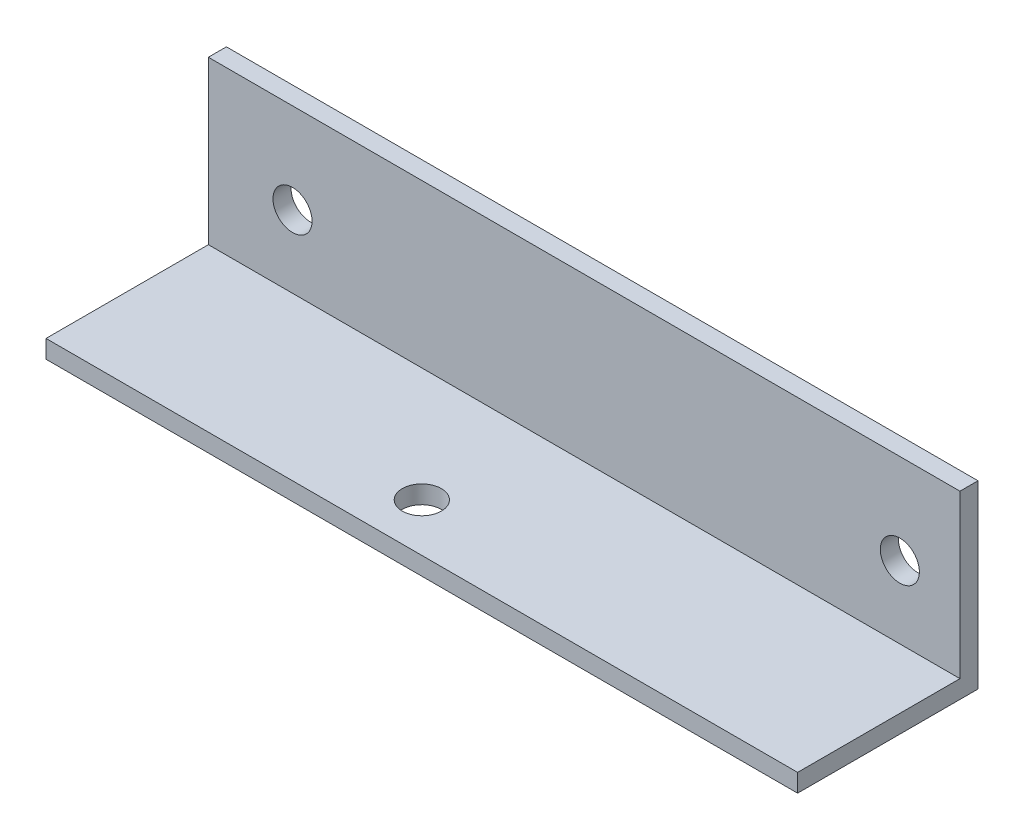
ISO-10303-21;
HEADER;
FILE_DESCRIPTION(('STEP AP214'),'2;1');
FILE_NAME('part.step','',(''),(''),'','','');
FILE_SCHEMA(('AUTOMOTIVE_DESIGN { 1 0 10303 214 1 1 1 1 }'));
ENDSEC;
DATA;
#1=APPLICATION_CONTEXT('core data for automotive mechanical design processes');
#2=APPLICATION_PROTOCOL_DEFINITION('international standard','automotive_design',2000,#1);
#3=PRODUCT_CONTEXT('',#1,'mechanical');
#4=PRODUCT('Part','Part','',(#3));
#5=PRODUCT_RELATED_PRODUCT_CATEGORY('part','',(#4));
#6=PRODUCT_DEFINITION_FORMATION('','',#4);
#7=PRODUCT_DEFINITION_CONTEXT('part definition',#1,'design');
#8=PRODUCT_DEFINITION('design','',#6,#7);
#9=PRODUCT_DEFINITION_SHAPE('','',#8);
#10=(LENGTH_UNIT() NAMED_UNIT(*) SI_UNIT(.MILLI.,.METRE.));
#11=(NAMED_UNIT(*) PLANE_ANGLE_UNIT() SI_UNIT($,.RADIAN.));
#12=(NAMED_UNIT(*) SI_UNIT($,.STERADIAN.) SOLID_ANGLE_UNIT());
#13=UNCERTAINTY_MEASURE_WITH_UNIT(LENGTH_MEASURE(1.E-05),#10,'distance_accuracy_value','');
#14=(GEOMETRIC_REPRESENTATION_CONTEXT(3) GLOBAL_UNCERTAINTY_ASSIGNED_CONTEXT((#13)) GLOBAL_UNIT_ASSIGNED_CONTEXT((#10,
#11,#12)) REPRESENTATION_CONTEXT('',''));
#15=CARTESIAN_POINT('',(0.,0.,0.));
#16=DIRECTION('',(0.,0.,1.));
#17=DIRECTION('',(1.,0.,0.));
#18=AXIS2_PLACEMENT_3D('',#15,#16,#17);
#19=CARTESIAN_POINT('',(0.,0.,3.));
#20=DIRECTION('',(0.,0.,-1.));
#21=DIRECTION('',(-1.,0.,0.));
#22=AXIS2_PLACEMENT_3D('',#19,#20,#21);
#23=PLANE('',#22);
#24=CARTESIAN_POINT('',(-48.4999999999982,-2.22044604925031E-13,3.));
#25=DIRECTION('',(0.,0.,-1.));
#26=DIRECTION('',(-1.,0.,0.));
#27=AXIS2_PLACEMENT_3D('',#24,#25,#26);
#28=CIRCLE('',#27,3.24999999999999);
#29=CARTESIAN_POINT('',(-51.7499999999982,-2.22044604925031E-13,3.));
#30=VERTEX_POINT('',#29);
#31=EDGE_CURVE('E150',#30,#30,#28,.T.);
#32=ORIENTED_EDGE('',*,*,#31,.T.);
#33=EDGE_LOOP('',(#32));
#34=FACE_BOUND('',#33,.T.);
#35=CARTESIAN_POINT('',(52.5000000000018,1.55431223447522E-12,3.));
#36=DIRECTION('',(0.,0.,-1.));
#37=DIRECTION('',(-1.,0.,0.));
#38=AXIS2_PLACEMENT_3D('',#35,#36,#37);
#39=CIRCLE('',#38,3.24999999999999);
#40=CARTESIAN_POINT('',(49.2500000000018,1.55431223447522E-12,3.));
#41=VERTEX_POINT('',#40);
#42=EDGE_CURVE('E137',#41,#41,#39,.T.);
#43=ORIENTED_EDGE('',*,*,#42,.T.);
#44=EDGE_LOOP('',(#43));
#45=FACE_BOUND('',#44,.T.);
#46=DIRECTION('',(-1.,0.,0.));
#47=VECTOR('',#46,1.);
#48=CARTESIAN_POINT('',(-62.5,-12.,3.));
#49=LINE('',#48,#47);
#50=CARTESIAN_POINT('',(62.5,-12.,3.));
#51=VERTEX_POINT('',#50);
#52=CARTESIAN_POINT('',(-62.5,-12.,3.));
#53=VERTEX_POINT('',#52);
#54=EDGE_CURVE('E47',#51,#53,#49,.T.);
#55=ORIENTED_EDGE('',*,*,#54,.F.);
#56=DIRECTION('',(0.,1.,0.));
#57=VECTOR('',#56,1.);
#58=CARTESIAN_POINT('',(62.5,-15.,3.));
#59=LINE('',#58,#57);
#60=CARTESIAN_POINT('',(62.5,15.,3.));
#61=VERTEX_POINT('',#60);
#62=EDGE_CURVE('E85',#51,#61,#59,.T.);
#63=ORIENTED_EDGE('',*,*,#62,.T.);
#64=DIRECTION('',(-1.,0.,0.));
#65=VECTOR('',#64,1.);
#66=CARTESIAN_POINT('',(-62.5,15.,3.));
#67=LINE('',#66,#65);
#68=CARTESIAN_POINT('',(-62.5,15.,3.));
#69=VERTEX_POINT('',#68);
#70=EDGE_CURVE('E53',#61,#69,#67,.T.);
#71=ORIENTED_EDGE('',*,*,#70,.T.);
#72=DIRECTION('',(0.,-1.,0.));
#73=VECTOR('',#72,1.);
#74=CARTESIAN_POINT('',(-62.5,-15.,3.));
#75=LINE('',#74,#73);
#76=EDGE_CURVE('E96',#69,#53,#75,.T.);
#77=ORIENTED_EDGE('',*,*,#76,.T.);
#78=EDGE_LOOP('',(#55,#63,#71,#77));
#79=FACE_BOUND('',#78,.T.);
#80=ADVANCED_FACE('F32',(#34,#45,#79),#23,.F.);
#81=CARTESIAN_POINT('',(62.5,-15.,3.));
#82=DIRECTION('',(-1.,0.,0.));
#83=DIRECTION('',(0.,0.,1.));
#84=AXIS2_PLACEMENT_3D('',#81,#82,#83);
#85=PLANE('',#84);
#86=DIRECTION('',(0.,1.,0.));
#87=VECTOR('',#86,1.);
#88=CARTESIAN_POINT('',(62.5,-15.,0.));
#89=LINE('',#88,#87);
#90=CARTESIAN_POINT('',(62.5,-15.,0.));
#91=VERTEX_POINT('',#90);
#92=CARTESIAN_POINT('',(62.5,15.,0.));
#93=VERTEX_POINT('',#92);
#94=EDGE_CURVE('E92',#91,#93,#89,.T.);
#95=ORIENTED_EDGE('',*,*,#94,.T.);
#96=DIRECTION('',(0.,0.,-1.));
#97=VECTOR('',#96,1.);
#98=CARTESIAN_POINT('',(62.5,15.,3.));
#99=LINE('',#98,#97);
#100=EDGE_CURVE('E11',#61,#93,#99,.T.);
#101=ORIENTED_EDGE('',*,*,#100,.F.);
#102=ORIENTED_EDGE('',*,*,#62,.F.);
#103=DIRECTION('',(0.,0.,-1.));
#104=VECTOR('',#103,1.);
#105=CARTESIAN_POINT('',(62.5,-12.,30.));
#106=LINE('',#105,#104);
#107=CARTESIAN_POINT('',(62.5,-12.,30.));
#108=VERTEX_POINT('',#107);
#109=EDGE_CURVE('E100',#108,#51,#106,.T.);
#110=ORIENTED_EDGE('',*,*,#109,.F.);
#111=DIRECTION('',(0.,1.,0.));
#112=VECTOR('',#111,1.);
#113=CARTESIAN_POINT('',(62.5,-12.,30.));
#114=LINE('',#113,#112);
#115=CARTESIAN_POINT('',(62.5,-15.,30.));
#116=VERTEX_POINT('',#115);
#117=EDGE_CURVE('E95',#116,#108,#114,.T.);
#118=ORIENTED_EDGE('',*,*,#117,.F.);
#119=DIRECTION('',(0.,0.,-1.));
#120=VECTOR('',#119,1.);
#121=CARTESIAN_POINT('',(62.5,-15.,3.));
#122=LINE('',#121,#120);
#123=EDGE_CURVE('E78',#116,#91,#122,.T.);
#124=ORIENTED_EDGE('',*,*,#123,.T.);
#125=EDGE_LOOP('',(#95,#101,#102,#110,#118,#124));
#126=FACE_BOUND('',#125,.T.);
#127=ADVANCED_FACE('F34',(#126),#85,.F.);
#128=CARTESIAN_POINT('',(-62.5,15.,3.));
#129=DIRECTION('',(0.,-1.,0.));
#130=DIRECTION('',(0.,0.,-1.));
#131=AXIS2_PLACEMENT_3D('',#128,#129,#130);
#132=PLANE('',#131);
#133=DIRECTION('',(-1.,0.,0.));
#134=VECTOR('',#133,1.);
#135=CARTESIAN_POINT('',(-62.5,15.,0.));
#136=LINE('',#135,#134);
#137=CARTESIAN_POINT('',(-62.5,15.,0.));
#138=VERTEX_POINT('',#137);
#139=EDGE_CURVE('E99',#93,#138,#136,.T.);
#140=ORIENTED_EDGE('',*,*,#139,.T.);
#141=DIRECTION('',(0.,0.,-1.));
#142=VECTOR('',#141,1.);
#143=CARTESIAN_POINT('',(-62.5,15.,3.));
#144=LINE('',#143,#142);
#145=EDGE_CURVE('E40',#69,#138,#144,.T.);
#146=ORIENTED_EDGE('',*,*,#145,.F.);
#147=ORIENTED_EDGE('',*,*,#70,.F.);
#148=ORIENTED_EDGE('',*,*,#100,.T.);
#149=EDGE_LOOP('',(#140,#146,#147,#148));
#150=FACE_BOUND('',#149,.T.);
#151=ADVANCED_FACE('F116',(#150),#132,.F.);
#152=CARTESIAN_POINT('',(-62.5,-15.,3.));
#153=DIRECTION('',(1.,0.,0.));
#154=DIRECTION('',(0.,0.,-1.));
#155=AXIS2_PLACEMENT_3D('',#152,#153,#154);
#156=PLANE('',#155);
#157=DIRECTION('',(0.,-1.,0.));
#158=VECTOR('',#157,1.);
#159=CARTESIAN_POINT('',(-62.5,-15.,0.));
#160=LINE('',#159,#158);
#161=CARTESIAN_POINT('',(-62.5,-15.,0.));
#162=VERTEX_POINT('',#161);
#163=EDGE_CURVE('E86',#138,#162,#160,.T.);
#164=ORIENTED_EDGE('',*,*,#163,.T.);
#165=DIRECTION('',(0.,0.,-1.));
#166=VECTOR('',#165,1.);
#167=CARTESIAN_POINT('',(-62.5,-15.,3.));
#168=LINE('',#167,#166);
#169=CARTESIAN_POINT('',(-62.5,-15.,30.));
#170=VERTEX_POINT('',#169);
#171=EDGE_CURVE('E81',#170,#162,#168,.T.);
#172=ORIENTED_EDGE('',*,*,#171,.F.);
#173=DIRECTION('',(0.,-1.,0.));
#174=VECTOR('',#173,1.);
#175=CARTESIAN_POINT('',(-62.5,-15.,30.));
#176=LINE('',#175,#174);
#177=CARTESIAN_POINT('',(-62.5,-12.,30.));
#178=VERTEX_POINT('',#177);
#179=EDGE_CURVE('E136',#178,#170,#176,.T.);
#180=ORIENTED_EDGE('',*,*,#179,.F.);
#181=DIRECTION('',(0.,0.,-1.));
#182=VECTOR('',#181,1.);
#183=CARTESIAN_POINT('',(-62.5,-12.,30.));
#184=LINE('',#183,#182);
#185=EDGE_CURVE('E104',#178,#53,#184,.T.);
#186=ORIENTED_EDGE('',*,*,#185,.T.);
#187=ORIENTED_EDGE('',*,*,#76,.F.);
#188=ORIENTED_EDGE('',*,*,#145,.T.);
#189=EDGE_LOOP('',(#164,#172,#180,#186,#187,#188));
#190=FACE_BOUND('',#189,.T.);
#191=ADVANCED_FACE('F113',(#190),#156,.F.);
#192=CARTESIAN_POINT('',(-62.5,-15.,3.));
#193=DIRECTION('',(0.,1.,0.));
#194=DIRECTION('',(0.,0.,1.));
#195=AXIS2_PLACEMENT_3D('',#192,#193,#194);
#196=PLANE('',#195);
#197=CARTESIAN_POINT('',(-8.0000029205029,-15.,22.0000000000014));
#198=DIRECTION('',(0.,-1.,0.));
#199=DIRECTION('',(0.,0.,-1.));
#200=AXIS2_PLACEMENT_3D('',#197,#198,#199);
#201=CIRCLE('',#200,3.24999999999999);
#202=CARTESIAN_POINT('',(-8.0000029205029,-15.,18.7500000000015));
#203=VERTEX_POINT('',#202);
#204=EDGE_CURVE('E159',#203,#203,#201,.T.);
#205=ORIENTED_EDGE('',*,*,#204,.F.);
#206=EDGE_LOOP('',(#205));
#207=FACE_BOUND('',#206,.T.);
#208=DIRECTION('',(1.,0.,0.));
#209=VECTOR('',#208,1.);
#210=CARTESIAN_POINT('',(-62.5,-15.,0.));
#211=LINE('',#210,#209);
#212=EDGE_CURVE('E73',#162,#91,#211,.T.);
#213=ORIENTED_EDGE('',*,*,#212,.T.);
#214=ORIENTED_EDGE('',*,*,#123,.F.);
#215=DIRECTION('',(1.,0.,0.));
#216=VECTOR('',#215,1.);
#217=CARTESIAN_POINT('',(-62.5,-15.,30.));
#218=LINE('',#217,#216);
#219=EDGE_CURVE('E132',#170,#116,#218,.T.);
#220=ORIENTED_EDGE('',*,*,#219,.F.);
#221=ORIENTED_EDGE('',*,*,#171,.T.);
#222=EDGE_LOOP('',(#213,#214,#220,#221));
#223=FACE_BOUND('',#222,.T.);
#224=ADVANCED_FACE('F75',(#207,#223),#196,.F.);
#225=CARTESIAN_POINT('',(0.,0.,0.));
#226=DIRECTION('',(0.,0.,-1.));
#227=DIRECTION('',(-1.,0.,0.));
#228=AXIS2_PLACEMENT_3D('',#225,#226,#227);
#229=PLANE('',#228);
#230=CARTESIAN_POINT('',(-48.4999999999982,-2.22044604925031E-13,0.));
#231=DIRECTION('',(0.,0.,-1.));
#232=DIRECTION('',(-1.,0.,0.));
#233=AXIS2_PLACEMENT_3D('',#230,#231,#232);
#234=CIRCLE('',#233,3.24999999999999);
#235=CARTESIAN_POINT('',(-51.7499999999982,-2.22044604925031E-13,0.));
#236=VERTEX_POINT('',#235);
#237=EDGE_CURVE('E153',#236,#236,#234,.T.);
#238=ORIENTED_EDGE('',*,*,#237,.F.);
#239=EDGE_LOOP('',(#238));
#240=FACE_BOUND('',#239,.T.);
#241=CARTESIAN_POINT('',(52.5000000000018,1.55431223447522E-12,0.));
#242=DIRECTION('',(0.,0.,-1.));
#243=DIRECTION('',(-1.,0.,0.));
#244=AXIS2_PLACEMENT_3D('',#241,#242,#243);
#245=CIRCLE('',#244,3.24999999999999);
#246=CARTESIAN_POINT('',(49.2500000000018,1.55431223447522E-12,0.));
#247=VERTEX_POINT('',#246);
#248=EDGE_CURVE('E147',#247,#247,#245,.T.);
#249=ORIENTED_EDGE('',*,*,#248,.F.);
#250=EDGE_LOOP('',(#249));
#251=FACE_BOUND('',#250,.T.);
#252=ORIENTED_EDGE('',*,*,#94,.F.);
#253=ORIENTED_EDGE('',*,*,#212,.F.);
#254=ORIENTED_EDGE('',*,*,#163,.F.);
#255=ORIENTED_EDGE('',*,*,#139,.F.);
#256=EDGE_LOOP('',(#252,#253,#254,#255));
#257=FACE_BOUND('',#256,.T.);
#258=ADVANCED_FACE('F98',(#240,#251,#257),#229,.T.);
#259=CARTESIAN_POINT('',(-62.5,-12.,30.));
#260=DIRECTION('',(0.,-1.,0.));
#261=DIRECTION('',(0.,0.,-1.));
#262=AXIS2_PLACEMENT_3D('',#259,#260,#261);
#263=PLANE('',#262);
#264=CARTESIAN_POINT('',(-8.0000029205029,-12.,22.0000000000014));
#265=DIRECTION('',(0.,-1.,0.));
#266=DIRECTION('',(0.,0.,-1.));
#267=AXIS2_PLACEMENT_3D('',#264,#265,#266);
#268=CIRCLE('',#267,3.24999999999999);
#269=CARTESIAN_POINT('',(-8.0000029205029,-12.,18.7500000000015));
#270=VERTEX_POINT('',#269);
#271=EDGE_CURVE('E156',#270,#270,#268,.T.);
#272=ORIENTED_EDGE('',*,*,#271,.T.);
#273=EDGE_LOOP('',(#272));
#274=FACE_BOUND('',#273,.T.);
#275=ORIENTED_EDGE('',*,*,#54,.T.);
#276=ORIENTED_EDGE('',*,*,#185,.F.);
#277=DIRECTION('',(-1.,0.,0.));
#278=VECTOR('',#277,1.);
#279=CARTESIAN_POINT('',(-62.5,-12.,30.));
#280=LINE('',#279,#278);
#281=EDGE_CURVE('E125',#108,#178,#280,.T.);
#282=ORIENTED_EDGE('',*,*,#281,.F.);
#283=ORIENTED_EDGE('',*,*,#109,.T.);
#284=EDGE_LOOP('',(#275,#276,#282,#283));
#285=FACE_BOUND('',#284,.T.);
#286=ADVANCED_FACE('F121',(#274,#285),#263,.F.);
#287=CARTESIAN_POINT('',(0.,0.,30.));
#288=DIRECTION('',(0.,0.,-1.));
#289=DIRECTION('',(-1.,0.,0.));
#290=AXIS2_PLACEMENT_3D('',#287,#288,#289);
#291=PLANE('',#290);
#292=ORIENTED_EDGE('',*,*,#179,.T.);
#293=ORIENTED_EDGE('',*,*,#219,.T.);
#294=ORIENTED_EDGE('',*,*,#117,.T.);
#295=ORIENTED_EDGE('',*,*,#281,.T.);
#296=EDGE_LOOP('',(#292,#293,#294,#295));
#297=FACE_BOUND('',#296,.T.);
#298=ADVANCED_FACE('F142',(#297),#291,.F.);
#299=CARTESIAN_POINT('',(52.5000000000018,1.55431223447522E-12,0.));
#300=DIRECTION('',(0.,0.,-1.));
#301=DIRECTION('',(-1.,0.,0.));
#302=AXIS2_PLACEMENT_3D('',#299,#300,#301);
#303=CYLINDRICAL_SURFACE('',#302,3.24999999999999);
#304=ORIENTED_EDGE('',*,*,#248,.T.);
#305=EDGE_LOOP('',(#304));
#306=FACE_BOUND('',#305,.T.);
#307=ORIENTED_EDGE('',*,*,#42,.F.);
#308=EDGE_LOOP('',(#307));
#309=FACE_BOUND('',#308,.T.);
#310=ADVANCED_FACE('F188',(#306,#309),#303,.F.);
#311=CARTESIAN_POINT('',(-48.4999999999982,-2.22044604925031E-13,0.));
#312=DIRECTION('',(0.,0.,-1.));
#313=DIRECTION('',(-1.,0.,0.));
#314=AXIS2_PLACEMENT_3D('',#311,#312,#313);
#315=CYLINDRICAL_SURFACE('',#314,3.24999999999999);
#316=ORIENTED_EDGE('',*,*,#237,.T.);
#317=EDGE_LOOP('',(#316));
#318=FACE_BOUND('',#317,.T.);
#319=ORIENTED_EDGE('',*,*,#31,.F.);
#320=EDGE_LOOP('',(#319));
#321=FACE_BOUND('',#320,.T.);
#322=ADVANCED_FACE('F191',(#318,#321),#315,.F.);
#323=CARTESIAN_POINT('',(-8.0000029205029,-15.,22.0000000000014));
#324=DIRECTION('',(0.,-1.,0.));
#325=DIRECTION('',(0.,0.,-1.));
#326=AXIS2_PLACEMENT_3D('',#323,#324,#325);
#327=CYLINDRICAL_SURFACE('',#326,3.24999999999999);
#328=ORIENTED_EDGE('',*,*,#204,.T.);
#329=EDGE_LOOP('',(#328));
#330=FACE_BOUND('',#329,.T.);
#331=ORIENTED_EDGE('',*,*,#271,.F.);
#332=EDGE_LOOP('',(#331));
#333=FACE_BOUND('',#332,.T.);
#334=ADVANCED_FACE('F163',(#330,#333),#327,.F.);
#335=CLOSED_SHELL('',(#80,#127,#151,#191,#224,#258,#286,#298,#310,#322,#334));
#336=MANIFOLD_SOLID_BREP('B2',#335);
#337=ADVANCED_BREP_SHAPE_REPRESENTATION('',(#18,#336),#14);
#338=SHAPE_DEFINITION_REPRESENTATION(#9,#337);
ENDSEC;
END-ISO-10303-21;
